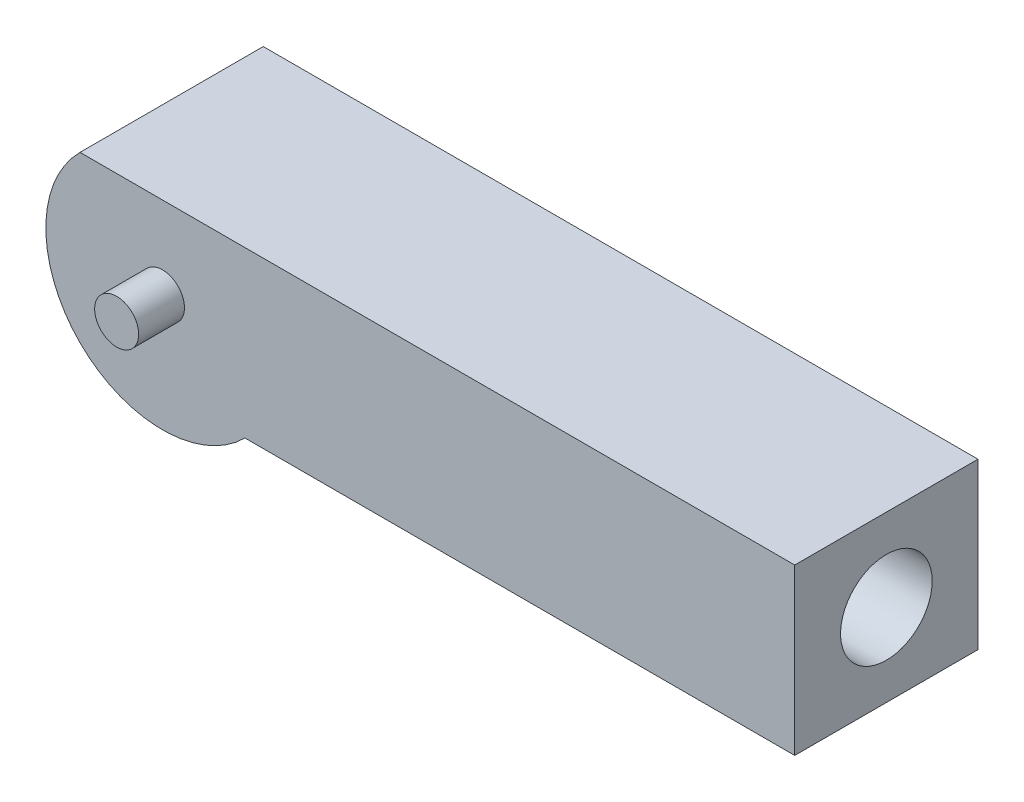
ISO-10303-21;
HEADER;
FILE_DESCRIPTION(('STEP AP214'),'2;1');
FILE_NAME('part.step','',(''),(''),'','','');
FILE_SCHEMA(('AUTOMOTIVE_DESIGN { 1 0 10303 214 1 1 1 1 }'));
ENDSEC;
DATA;
#1=APPLICATION_CONTEXT('core data for automotive mechanical design processes');
#2=APPLICATION_PROTOCOL_DEFINITION('international standard','automotive_design',2000,#1);
#3=PRODUCT_CONTEXT('',#1,'mechanical');
#4=PRODUCT('Part','Part','',(#3));
#5=PRODUCT_RELATED_PRODUCT_CATEGORY('part','',(#4));
#6=PRODUCT_DEFINITION_FORMATION('','',#4);
#7=PRODUCT_DEFINITION_CONTEXT('part definition',#1,'design');
#8=PRODUCT_DEFINITION('design','',#6,#7);
#9=PRODUCT_DEFINITION_SHAPE('','',#8);
#10=(LENGTH_UNIT() NAMED_UNIT(*) SI_UNIT(.MILLI.,.METRE.));
#11=(NAMED_UNIT(*) PLANE_ANGLE_UNIT() SI_UNIT($,.RADIAN.));
#12=(NAMED_UNIT(*) SI_UNIT($,.STERADIAN.) SOLID_ANGLE_UNIT());
#13=UNCERTAINTY_MEASURE_WITH_UNIT(LENGTH_MEASURE(1.E-05),#10,'distance_accuracy_value','');
#14=(GEOMETRIC_REPRESENTATION_CONTEXT(3) GLOBAL_UNCERTAINTY_ASSIGNED_CONTEXT((#13)) GLOBAL_UNIT_ASSIGNED_CONTEXT((#10,
#11,#12)) REPRESENTATION_CONTEXT('',''));
#15=CARTESIAN_POINT('',(0.,0.,0.));
#16=DIRECTION('',(0.,0.,1.));
#17=DIRECTION('',(1.,0.,0.));
#18=AXIS2_PLACEMENT_3D('',#15,#16,#17);
#19=CARTESIAN_POINT('',(-5.715,5.715,12.7));
#20=DIRECTION('',(0.,-1.,0.));
#21=DIRECTION('',(0.,0.,-1.));
#22=AXIS2_PLACEMENT_3D('',#19,#20,#21);
#23=PLANE('',#22);
#24=DIRECTION('',(-1.,0.,0.));
#25=VECTOR('',#24,1.);
#26=CARTESIAN_POINT('',(-5.715,5.715,0.));
#27=LINE('',#26,#25);
#28=CARTESIAN_POINT('',(43.815,5.715,0.));
#29=VERTEX_POINT('',#28);
#30=CARTESIAN_POINT('',(-5.715,5.715,0.));
#31=VERTEX_POINT('',#30);
#32=EDGE_CURVE('E82',#29,#31,#27,.T.);
#33=ORIENTED_EDGE('',*,*,#32,.T.);
#34=DIRECTION('',(0.,0.,-1.));
#35=VECTOR('',#34,1.);
#36=CARTESIAN_POINT('',(-5.715,5.715,12.7));
#37=LINE('',#36,#35);
#38=CARTESIAN_POINT('',(-5.715,5.715,12.7));
#39=VERTEX_POINT('',#38);
#40=EDGE_CURVE('E49',#39,#31,#37,.T.);
#41=ORIENTED_EDGE('',*,*,#40,.F.);
#42=DIRECTION('',(-1.,0.,0.));
#43=VECTOR('',#42,1.);
#44=CARTESIAN_POINT('',(43.815,5.715,12.7));
#45=LINE('',#44,#43);
#46=CARTESIAN_POINT('',(43.815,5.715,12.7));
#47=VERTEX_POINT('',#46);
#48=EDGE_CURVE('E87',#47,#39,#45,.T.);
#49=ORIENTED_EDGE('',*,*,#48,.F.);
#50=DIRECTION('',(0.,0.,-1.));
#51=VECTOR('',#50,1.);
#52=CARTESIAN_POINT('',(43.815,5.715,12.7));
#53=LINE('',#52,#51);
#54=EDGE_CURVE('E109',#47,#29,#53,.T.);
#55=ORIENTED_EDGE('',*,*,#54,.T.);
#56=EDGE_LOOP('',(#33,#41,#49,#55));
#57=FACE_BOUND('',#56,.T.);
#58=ADVANCED_FACE('F39',(#57),#23,.F.);
#59=CARTESIAN_POINT('',(0.,0.,12.7));
#60=DIRECTION('',(0.,0.,-1.));
#61=DIRECTION('',(-1.,0.,0.));
#62=AXIS2_PLACEMENT_3D('',#59,#60,#61);
#63=CYLINDRICAL_SURFACE('',#62,8.08223050896224);
#64=CARTESIAN_POINT('',(-8.08223050896224,0.,3.175));
#65=CARTESIAN_POINT('',(-8.08222571121766,0.170912457708188,3.17500627327733));
#66=CARTESIAN_POINT('',(-8.07674749755869,0.34211627153908,3.18887924745386));
#67=CARTESIAN_POINT('',(-8.05538589789552,0.679682509297345,3.24387033609095));
#68=CARTESIAN_POINT('',(-8.03947587145426,0.846031395719252,3.28505820957658));
#69=CARTESIAN_POINT('',(-7.99896072163177,1.16850376552217,3.39296965070885));
#70=CARTESIAN_POINT('',(-7.97438302119579,1.32465767840459,3.45961273730372));
#71=CARTESIAN_POINT('',(-7.91896528004085,1.62343997181847,3.61622330428965));
#72=CARTESIAN_POINT('',(-7.88812716831027,1.76607249881394,3.70618360242546));
#73=CARTESIAN_POINT('',(-7.82174320507454,2.04047538183205,3.91122435405536));
#74=CARTESIAN_POINT('',(-7.78605475996245,2.17154577497111,4.02719510320907));
#75=CARTESIAN_POINT('',(-7.7146572882508,2.41296358016667,4.27908506175269));
#76=CARTESIAN_POINT('',(-7.67894825970887,2.52330147742655,4.41501337957186));
#77=CARTESIAN_POINT('',(-7.60986540701512,2.72474562390125,4.70999631132431));
#78=CARTESIAN_POINT('',(-7.57665579551939,2.81483274278404,4.86978927708936));
#79=CARTESIAN_POINT('',(-7.51855975962237,2.96653969969084,5.20376203409886));
#80=CARTESIAN_POINT('',(-7.49366955183149,3.02817248268064,5.37793524062326));
#81=CARTESIAN_POINT('',(-7.45655703288272,3.11841417480508,5.7276872816071));
#82=CARTESIAN_POINT('',(-7.44382423854889,3.14836019352243,5.90286501665683));
#83=CARTESIAN_POINT('',(-7.4309841834096,3.17855646340839,6.25618614421094));
#84=CARTESIAN_POINT('',(-7.43087100612545,3.17882063037557,6.43432810780975));
#85=CARTESIAN_POINT('',(-7.44284608408084,3.15066172636285,6.77585669389809));
#86=CARTESIAN_POINT('',(-7.45412101141219,3.12415090919904,6.93943496669067));
#87=CARTESIAN_POINT('',(-7.48624073516336,3.04637507122708,7.25960109956646));
#88=CARTESIAN_POINT('',(-7.50708713712283,2.99510589732448,7.41618778202822));
#89=CARTESIAN_POINT('',(-7.55645182439754,2.86830561888839,7.72162201735319));
#90=CARTESIAN_POINT('',(-7.58511522313091,2.79230973692446,7.87025212364356));
#91=CARTESIAN_POINT('',(-7.64684189380296,2.61853884496656,8.1531824912489));
#92=CARTESIAN_POINT('',(-7.6799067787482,2.52075584178223,8.28747746652199));
#93=CARTESIAN_POINT('',(-7.74970537060228,2.29763965241437,8.54842810230915));
#94=CARTESIAN_POINT('',(-7.78652910748837,2.17079899326834,8.67377414217492));
#95=CARTESIAN_POINT('',(-7.85760017248409,1.89749537477081,8.90182642968068));
#96=CARTESIAN_POINT('',(-7.89184702237394,1.75102878718714,9.00452848183239));
#97=CARTESIAN_POINT('',(-7.95470958025575,1.43902621396131,9.18601422590363));
#98=CARTESIAN_POINT('',(-7.98320977221345,1.27318832736093,9.2643218097073));
#99=CARTESIAN_POINT('',(-8.03049952381855,0.929290879726307,9.39148085503649));
#100=CARTESIAN_POINT('',(-8.04929383431654,0.751237346469818,9.4403467296936));
#101=CARTESIAN_POINT('',(-8.07419736803321,0.398953484136747,9.50462503368543));
#102=CARTESIAN_POINT('',(-8.08097346209177,0.225091404539904,9.52179846037364));
#103=CARTESIAN_POINT('',(-8.08316607126668,-0.12314455974585,9.52738312860005));
#104=CARTESIAN_POINT('',(-8.07858540294674,-0.297518306824158,9.51580150160992));
#105=CARTESIAN_POINT('',(-8.05901690787063,-0.633955037083676,9.46551295032609));
#106=CARTESIAN_POINT('',(-8.04448507308402,-0.796224962448529,9.42799386599921));
#107=CARTESIAN_POINT('',(-8.00694395748347,-1.11202713947698,9.32849636503791));
#108=CARTESIAN_POINT('',(-7.98393358227326,-1.26555826019497,9.2665147907514));
#109=CARTESIAN_POINT('',(-7.9308131433284,-1.5647523760128,9.11783803257781));
#110=CARTESIAN_POINT('',(-7.90050909028502,-1.71003602854998,9.03045095176794));
#111=CARTESIAN_POINT('',(-7.8361067175343,-1.98438177985261,8.83421525959325));
#112=CARTESIAN_POINT('',(-7.80200691089615,-2.11343747909632,8.72535822470867));
#113=CARTESIAN_POINT('',(-7.73104506269982,-2.36028138428383,8.48113192673457));
#114=CARTESIAN_POINT('',(-7.6941454382933,-2.4768280940617,8.34451550228186));
#115=CARTESIAN_POINT('',(-7.623779830661,-2.6856292152136,8.05298832193172));
#116=CARTESIAN_POINT('',(-7.59031433152864,-2.77788020459082,7.89807499340312));
#117=CARTESIAN_POINT('',(-7.53061550533607,-2.93589979687648,7.57234371479535));
#118=CARTESIAN_POINT('',(-7.5044417603351,-3.0014521380345,7.40140916376662));
#119=CARTESIAN_POINT('',(-7.46330078408127,-3.10235675819775,7.04959541350037));
#120=CARTESIAN_POINT('',(-7.44832568587479,-3.13773024005876,6.86872329138696));
#121=CARTESIAN_POINT('',(-7.43238884177752,-3.17528320072074,6.51576462413231));
#122=CARTESIAN_POINT('',(-7.4305223796937,-3.17960619800924,6.34394543182007));
#123=CARTESIAN_POINT('',(-7.43865861304105,-3.16052444776518,6.00215712997079));
#124=CARTESIAN_POINT('',(-7.44865992418972,-3.13712293407948,5.83218780699454));
#125=CARTESIAN_POINT('',(-7.47861953708219,-3.06498421653818,5.50531294535726));
#126=CARTESIAN_POINT('',(-7.49819809543651,-3.01721050561227,5.34815685005759));
#127=CARTESIAN_POINT('',(-7.54485180636103,-2.89856921065578,5.044019422389));
#128=CARTESIAN_POINT('',(-7.57192893591974,-2.8276955354767,4.89704078608597));
#129=CARTESIAN_POINT('',(-7.63240983080415,-2.66028254981663,4.6084828602896));
#130=CARTESIAN_POINT('',(-7.66608265932715,-2.56252991566024,4.46766477480153));
#131=CARTESIAN_POINT('',(-7.73511237539167,-2.34593129862211,4.20374880821673));
#132=CARTESIAN_POINT('',(-7.77046984338127,-2.22707800642053,4.08065709442579));
#133=CARTESIAN_POINT('',(-7.84150567290015,-1.96292013944275,3.84791487038207));
#134=CARTESIAN_POINT('',(-7.87706913976778,-1.8164357144146,3.73956292916075));
#135=CARTESIAN_POINT('',(-7.94225265376782,-1.5060419720262,3.5490008460992));
#136=CARTESIAN_POINT('',(-7.97187189438218,-1.34213029472973,3.46679425079967));
#137=CARTESIAN_POINT('',(-8.01968415649821,-1.01586495967854,3.33722455581975));
#138=CARTESIAN_POINT('',(-8.03863280579543,-0.854556556515689,3.28749893116469));
#139=CARTESIAN_POINT('',(-8.06680508635042,-0.525541654169048,3.21428926587347));
#140=CARTESIAN_POINT('',(-8.07605548730901,-0.357854097824392,3.19073298023175));
#141=CARTESIAN_POINT('',(-8.08074914005573,-0.157964518146988,3.17877340597985));
#142=CARTESIAN_POINT('',(-8.08130386987934,-0.12639397656276,3.17735944443194));
#143=CARTESIAN_POINT('',(-8.08204500772279,-0.0632189474220659,3.17547213657452));
#144=CARTESIAN_POINT('',(-8.08223139642297,-0.0316144581720148,3.17499883960323));
#145=CARTESIAN_POINT('',(-8.08223050896224,0.,3.175));
#146=B_SPLINE_CURVE_WITH_KNOTS('',3,(#64,#65,#66,#67,#68,#69,#70,#71,#72,#73,#74,#75,#76,#77,
#78,#79,#80,#81,#82,#83,#84,#85,#86,#87,#88,#89,#90,#91,#92,#93,#94,#95,#96,#97,#98,#99,#100,
#101,#102,#103,#104,#105,#106,#107,#108,#109,#110,#111,#112,#113,#114,#115,#116,#117,#118,#119,
#120,#121,#122,#123,#124,#125,#126,#127,#128,#129,#130,#131,#132,#133,#134,#135,#136,#137,#138,
#139,#140,#141,#142,#143,#144,#145),.UNSPECIFIED.,.T.,.F.,(4,2,2,2,2,2,2,2,2,2,2,2,2,2,2,2,2,2,
2,2,2,2,2,2,2,2,2,2,2,2,2,2,2,2,2,2,2,2,2,2,4),(0.,0.512608260572087,1.0265307296485,
1.53884161650423,2.05099488657763,2.58448216879821,3.11821369035351,3.67467519009344,
4.23088328414382,4.76255008449402,5.29396762145425,5.78993978870464,6.28599518179925,
6.7919727209916,7.29813619818397,7.84191946016769,8.38580339005099,8.93971911910018,
9.49336345897982,10.0151933967368,10.5368939296346,11.036160639206,11.5354918159047,
12.0499522320487,12.5646148945059,13.1120632183004,13.6595886077558,14.2114647922489,
14.7629529233085,15.2759682981015,15.7889238395637,16.2830130768459,16.7772327043309,
17.2990814773731,17.821111374087,18.3753623687524,18.9296885139313,19.4370357110499,
19.9429787803862,20.0377932994352,20.1326127914125),.UNSPECIFIED.);
#147=CARTESIAN_POINT('',(-8.08223050896224,0.,3.175));
#148=VERTEX_POINT('',#147);
#149=EDGE_CURVE('E141',#148,#148,#146,.T.);
#150=ORIENTED_EDGE('',*,*,#149,.T.);
#151=EDGE_LOOP('',(#150));
#152=FACE_BOUND('',#151,.T.);
#153=CARTESIAN_POINT('',(0.,0.,0.));
#154=DIRECTION('',(0.,0.,1.));
#155=DIRECTION('',(1.,0.,0.));
#156=AXIS2_PLACEMENT_3D('',#153,#154,#155);
#157=CIRCLE('',#156,8.08223050896224);
#158=CARTESIAN_POINT('',(5.715,-5.715,0.));
#159=VERTEX_POINT('',#158);
#160=EDGE_CURVE('E101',#31,#159,#157,.T.);
#161=ORIENTED_EDGE('',*,*,#160,.T.);
#162=DIRECTION('',(0.,0.,-1.));
#163=VECTOR('',#162,1.);
#164=CARTESIAN_POINT('',(5.715,-5.715,12.7));
#165=LINE('',#164,#163);
#166=CARTESIAN_POINT('',(5.715,-5.715,12.7));
#167=VERTEX_POINT('',#166);
#168=EDGE_CURVE('E99',#167,#159,#165,.T.);
#169=ORIENTED_EDGE('',*,*,#168,.F.);
#170=CARTESIAN_POINT('',(0.,0.,12.7));
#171=DIRECTION('',(0.,0.,1.));
#172=DIRECTION('',(1.,0.,0.));
#173=AXIS2_PLACEMENT_3D('',#170,#171,#172);
#174=CIRCLE('',#173,8.08223050896224);
#175=EDGE_CURVE('E90',#39,#167,#174,.T.);
#176=ORIENTED_EDGE('',*,*,#175,.F.);
#177=ORIENTED_EDGE('',*,*,#40,.T.);
#178=EDGE_LOOP('',(#161,#169,#176,#177));
#179=FACE_BOUND('',#178,.T.);
#180=ADVANCED_FACE('F100',(#152,#179),#63,.T.);
#181=CARTESIAN_POINT('',(5.715,-5.715,12.7));
#182=DIRECTION('',(0.,1.,0.));
#183=DIRECTION('',(0.,0.,1.));
#184=AXIS2_PLACEMENT_3D('',#181,#182,#183);
#185=PLANE('',#184);
#186=DIRECTION('',(1.,0.,0.));
#187=VECTOR('',#186,1.);
#188=CARTESIAN_POINT('',(5.715,-5.715,0.));
#189=LINE('',#188,#187);
#190=CARTESIAN_POINT('',(43.815,-5.715,0.));
#191=VERTEX_POINT('',#190);
#192=EDGE_CURVE('E75',#159,#191,#189,.T.);
#193=ORIENTED_EDGE('',*,*,#192,.T.);
#194=DIRECTION('',(0.,0.,-1.));
#195=VECTOR('',#194,1.);
#196=CARTESIAN_POINT('',(43.815,-5.715,12.7));
#197=LINE('',#196,#195);
#198=CARTESIAN_POINT('',(43.815,-5.715,12.7));
#199=VERTEX_POINT('',#198);
#200=EDGE_CURVE('E103',#199,#191,#197,.T.);
#201=ORIENTED_EDGE('',*,*,#200,.F.);
#202=DIRECTION('',(1.,0.,0.));
#203=VECTOR('',#202,1.);
#204=CARTESIAN_POINT('',(5.715,-5.715,12.7));
#205=LINE('',#204,#203);
#206=EDGE_CURVE('E94',#167,#199,#205,.T.);
#207=ORIENTED_EDGE('',*,*,#206,.F.);
#208=ORIENTED_EDGE('',*,*,#168,.T.);
#209=EDGE_LOOP('',(#193,#201,#207,#208));
#210=FACE_BOUND('',#209,.T.);
#211=ADVANCED_FACE('F105',(#210),#185,.F.);
#212=CARTESIAN_POINT('',(43.815,-5.715,12.7));
#213=DIRECTION('',(-1.,0.,0.));
#214=DIRECTION('',(0.,0.,1.));
#215=AXIS2_PLACEMENT_3D('',#212,#213,#214);
#216=PLANE('',#215);
#217=CARTESIAN_POINT('',(43.815,0.,6.35));
#218=DIRECTION('',(1.,0.,0.));
#219=DIRECTION('',(0.,0.,-1.));
#220=AXIS2_PLACEMENT_3D('',#217,#218,#219);
#221=CIRCLE('',#220,3.175);
#222=CARTESIAN_POINT('',(43.815,0.,3.175));
#223=VERTEX_POINT('',#222);
#224=EDGE_CURVE('E149',#223,#223,#221,.T.);
#225=ORIENTED_EDGE('',*,*,#224,.F.);
#226=EDGE_LOOP('',(#225));
#227=FACE_BOUND('',#226,.T.);
#228=DIRECTION('',(0.,1.,0.));
#229=VECTOR('',#228,1.);
#230=CARTESIAN_POINT('',(43.815,-5.715,0.));
#231=LINE('',#230,#229);
#232=EDGE_CURVE('E119',#191,#29,#231,.T.);
#233=ORIENTED_EDGE('',*,*,#232,.T.);
#234=ORIENTED_EDGE('',*,*,#54,.F.);
#235=DIRECTION('',(0.,1.,0.));
#236=VECTOR('',#235,1.);
#237=CARTESIAN_POINT('',(43.815,-5.715,12.7));
#238=LINE('',#237,#236);
#239=EDGE_CURVE('E58',#199,#47,#238,.T.);
#240=ORIENTED_EDGE('',*,*,#239,.F.);
#241=ORIENTED_EDGE('',*,*,#200,.T.);
#242=EDGE_LOOP('',(#233,#234,#240,#241));
#243=FACE_BOUND('',#242,.T.);
#244=ADVANCED_FACE('F130',(#227,#243),#216,.F.);
#245=CARTESIAN_POINT('',(0.,0.,12.7));
#246=DIRECTION('',(0.,0.,1.));
#247=DIRECTION('',(1.,0.,0.));
#248=AXIS2_PLACEMENT_3D('',#245,#246,#247);
#249=PLANE('',#248);
#250=CARTESIAN_POINT('',(0.,0.,12.7));
#251=DIRECTION('',(0.,0.,1.));
#252=DIRECTION('',(1.,0.,0.));
#253=AXIS2_PLACEMENT_3D('',#250,#251,#252);
#254=CIRCLE('',#253,1.524);
#255=CARTESIAN_POINT('',(1.524,0.,12.7));
#256=VERTEX_POINT('',#255);
#257=EDGE_CURVE('E11',#256,#256,#254,.T.);
#258=ORIENTED_EDGE('',*,*,#257,.F.);
#259=EDGE_LOOP('',(#258));
#260=FACE_BOUND('',#259,.T.);
#261=ORIENTED_EDGE('',*,*,#48,.T.);
#262=ORIENTED_EDGE('',*,*,#175,.T.);
#263=ORIENTED_EDGE('',*,*,#206,.T.);
#264=ORIENTED_EDGE('',*,*,#239,.T.);
#265=EDGE_LOOP('',(#261,#262,#263,#264));
#266=FACE_BOUND('',#265,.T.);
#267=ADVANCED_FACE('F92',(#260,#266),#249,.T.);
#268=CARTESIAN_POINT('',(0.,0.,0.));
#269=DIRECTION('',(0.,0.,1.));
#270=DIRECTION('',(1.,0.,0.));
#271=AXIS2_PLACEMENT_3D('',#268,#269,#270);
#272=PLANE('',#271);
#273=CARTESIAN_POINT('',(0.,0.,0.));
#274=DIRECTION('',(0.,0.,1.));
#275=DIRECTION('',(1.,0.,0.));
#276=AXIS2_PLACEMENT_3D('',#273,#274,#275);
#277=CIRCLE('',#276,1.524);
#278=CARTESIAN_POINT('',(1.524,0.,0.));
#279=VERTEX_POINT('',#278);
#280=EDGE_CURVE('E42',#279,#279,#277,.T.);
#281=ORIENTED_EDGE('',*,*,#280,.T.);
#282=EDGE_LOOP('',(#281));
#283=FACE_BOUND('',#282,.T.);
#284=ORIENTED_EDGE('',*,*,#32,.F.);
#285=ORIENTED_EDGE('',*,*,#232,.F.);
#286=ORIENTED_EDGE('',*,*,#192,.F.);
#287=ORIENTED_EDGE('',*,*,#160,.F.);
#288=EDGE_LOOP('',(#284,#285,#286,#287));
#289=FACE_BOUND('',#288,.T.);
#290=ADVANCED_FACE('F128',(#283,#289),#272,.F.);
#291=CARTESIAN_POINT('',(0.,0.,-3.175));
#292=DIRECTION('',(0.,0.,1.));
#293=DIRECTION('',(1.,0.,0.));
#294=AXIS2_PLACEMENT_3D('',#291,#292,#293);
#295=PLANE('',#294);
#296=CARTESIAN_POINT('',(0.,0.,-3.175));
#297=DIRECTION('',(0.,0.,1.));
#298=DIRECTION('',(1.,0.,0.));
#299=AXIS2_PLACEMENT_3D('',#296,#297,#298);
#300=CIRCLE('',#299,1.524);
#301=CARTESIAN_POINT('',(1.524,0.,-3.175));
#302=VERTEX_POINT('',#301);
#303=EDGE_CURVE('E133',#302,#302,#300,.T.);
#304=ORIENTED_EDGE('',*,*,#303,.F.);
#305=EDGE_LOOP('',(#304));
#306=FACE_BOUND('',#305,.T.);
#307=ADVANCED_FACE('F162',(#306),#295,.F.);
#308=CARTESIAN_POINT('',(0.,0.,-3.175));
#309=DIRECTION('',(0.,0.,1.));
#310=DIRECTION('',(1.,0.,0.));
#311=AXIS2_PLACEMENT_3D('',#308,#309,#310);
#312=CYLINDRICAL_SURFACE('',#311,1.524);
#313=ORIENTED_EDGE('',*,*,#303,.T.);
#314=EDGE_LOOP('',(#313));
#315=FACE_BOUND('',#314,.T.);
#316=ORIENTED_EDGE('',*,*,#280,.F.);
#317=EDGE_LOOP('',(#316));
#318=FACE_BOUND('',#317,.T.);
#319=ADVANCED_FACE('F165',(#315,#318),#312,.T.);
#320=ORIENTED_EDGE('',*,*,#257,.T.);
#321=EDGE_LOOP('',(#320));
#322=FACE_BOUND('',#321,.T.);
#323=CARTESIAN_POINT('',(0.,0.,15.875));
#324=DIRECTION('',(0.,0.,1.));
#325=DIRECTION('',(1.,0.,0.));
#326=AXIS2_PLACEMENT_3D('',#323,#324,#325);
#327=CIRCLE('',#326,1.524);
#328=CARTESIAN_POINT('',(1.524,0.,15.875));
#329=VERTEX_POINT('',#328);
#330=EDGE_CURVE('E137',#329,#329,#327,.T.);
#331=ORIENTED_EDGE('',*,*,#330,.F.);
#332=EDGE_LOOP('',(#331));
#333=FACE_BOUND('',#332,.T.);
#334=ADVANCED_FACE('F160',(#322,#333),#312,.T.);
#335=CARTESIAN_POINT('',(0.,0.,15.875));
#336=DIRECTION('',(0.,0.,1.));
#337=DIRECTION('',(1.,0.,0.));
#338=AXIS2_PLACEMENT_3D('',#335,#336,#337);
#339=PLANE('',#338);
#340=ORIENTED_EDGE('',*,*,#330,.T.);
#341=EDGE_LOOP('',(#340));
#342=FACE_BOUND('',#341,.T.);
#343=ADVANCED_FACE('F156',(#342),#339,.T.);
#344=CARTESIAN_POINT('',(-8.08223050896224,0.,6.35));
#345=DIRECTION('',(1.,0.,0.));
#346=DIRECTION('',(0.,0.,-1.));
#347=AXIS2_PLACEMENT_3D('',#344,#345,#346);
#348=CYLINDRICAL_SURFACE('',#347,3.175);
#349=ORIENTED_EDGE('',*,*,#224,.T.);
#350=EDGE_LOOP('',(#349));
#351=FACE_BOUND('',#350,.T.);
#352=ORIENTED_EDGE('',*,*,#149,.F.);
#353=EDGE_LOOP('',(#352));
#354=FACE_BOUND('',#353,.T.);
#355=ADVANCED_FACE('F152',(#351,#354),#348,.F.);
#356=CLOSED_SHELL('',(#58,#180,#211,#244,#267,#290,#307,#319,#334,#343,#355));
#357=MANIFOLD_SOLID_BREP('B2',#356);
#358=ADVANCED_BREP_SHAPE_REPRESENTATION('',(#18,#357),#14);
#359=SHAPE_DEFINITION_REPRESENTATION(#9,#358);
ENDSEC;
END-ISO-10303-21;
